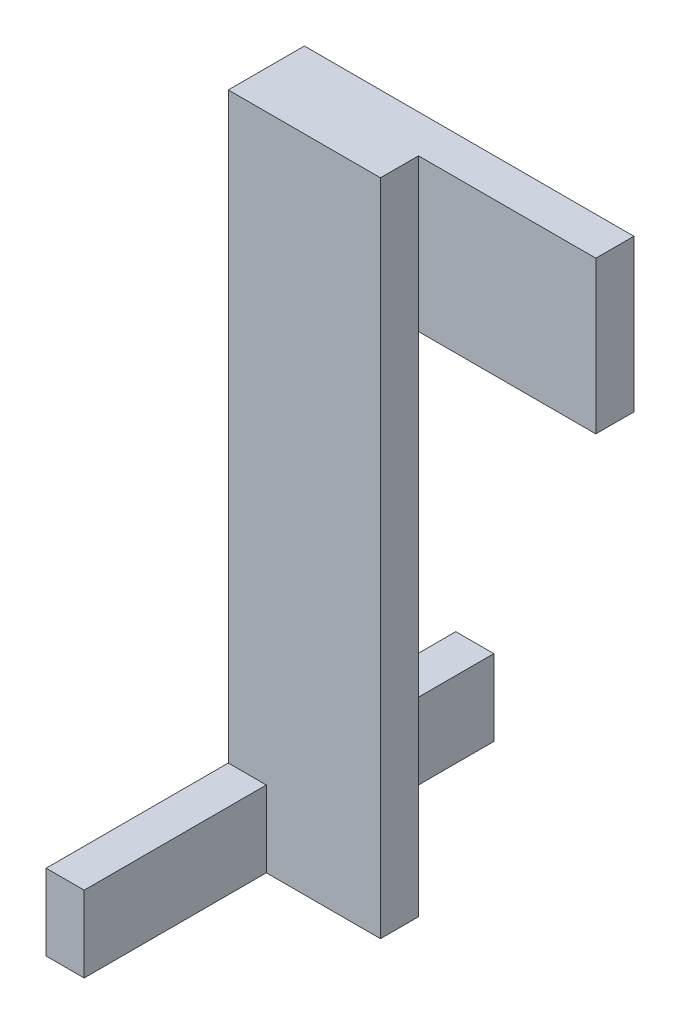
ISO-10303-21;
HEADER;
FILE_DESCRIPTION(('STEP AP214'),'2;1');
FILE_NAME('part.step','',(''),(''),'','','');
FILE_SCHEMA(('AUTOMOTIVE_DESIGN { 1 0 10303 214 1 1 1 1 }'));
ENDSEC;
DATA;
#1=APPLICATION_CONTEXT('core data for automotive mechanical design processes');
#2=APPLICATION_PROTOCOL_DEFINITION('international standard','automotive_design',2000,#1);
#3=PRODUCT_CONTEXT('',#1,'mechanical');
#4=PRODUCT('Part','Part','',(#3));
#5=PRODUCT_RELATED_PRODUCT_CATEGORY('part','',(#4));
#6=PRODUCT_DEFINITION_FORMATION('','',#4);
#7=PRODUCT_DEFINITION_CONTEXT('part definition',#1,'design');
#8=PRODUCT_DEFINITION('design','',#6,#7);
#9=PRODUCT_DEFINITION_SHAPE('','',#8);
#10=(LENGTH_UNIT() NAMED_UNIT(*) SI_UNIT(.MILLI.,.METRE.));
#11=(NAMED_UNIT(*) PLANE_ANGLE_UNIT() SI_UNIT($,.RADIAN.));
#12=(NAMED_UNIT(*) SI_UNIT($,.STERADIAN.) SOLID_ANGLE_UNIT());
#13=UNCERTAINTY_MEASURE_WITH_UNIT(LENGTH_MEASURE(1.E-05),#10,'distance_accuracy_value','');
#14=(GEOMETRIC_REPRESENTATION_CONTEXT(3) GLOBAL_UNCERTAINTY_ASSIGNED_CONTEXT((#13)) GLOBAL_UNIT_ASSIGNED_CONTEXT((#10,
#11,#12)) REPRESENTATION_CONTEXT('',''));
#15=CARTESIAN_POINT('',(0.,0.,0.));
#16=DIRECTION('',(0.,0.,1.));
#17=DIRECTION('',(1.,0.,0.));
#18=AXIS2_PLACEMENT_3D('',#15,#16,#17);
#19=CARTESIAN_POINT('',(0.,0.,0.));
#20=DIRECTION('',(0.,0.,1.));
#21=DIRECTION('',(1.,0.,0.));
#22=AXIS2_PLACEMENT_3D('',#19,#20,#21);
#23=PLANE('',#22);
#24=DIRECTION('',(0.,1.,0.));
#25=VECTOR('',#24,1.);
#26=CARTESIAN_POINT('',(-12.7,0.,0.));
#27=LINE('',#26,#25);
#28=CARTESIAN_POINT('',(-12.7,-110.,0.));
#29=VERTEX_POINT('',#28);
#30=CARTESIAN_POINT('',(-12.7,-84.6,0.));
#31=VERTEX_POINT('',#30);
#32=EDGE_CURVE('E148',#29,#31,#27,.T.);
#33=ORIENTED_EDGE('',*,*,#32,.T.);
#34=DIRECTION('',(-1.,0.,0.));
#35=VECTOR('',#34,1.);
#36=CARTESIAN_POINT('',(0.,-84.6,0.));
#37=LINE('',#36,#35);
#38=CARTESIAN_POINT('',(-25.4,-84.6,0.));
#39=VERTEX_POINT('',#38);
#40=EDGE_CURVE('E177',#31,#39,#37,.T.);
#41=ORIENTED_EDGE('',*,*,#40,.T.);
#42=DIRECTION('',(0.,-1.,0.));
#43=VECTOR('',#42,1.);
#44=CARTESIAN_POINT('',(-25.4,-110.,0.));
#45=LINE('',#44,#43);
#46=CARTESIAN_POINT('',(-25.4,59.2,0.));
#47=VERTEX_POINT('',#46);
#48=EDGE_CURVE('E206',#47,#39,#45,.T.);
#49=ORIENTED_EDGE('',*,*,#48,.F.);
#50=DIRECTION('',(-1.,0.,0.));
#51=VECTOR('',#50,1.);
#52=CARTESIAN_POINT('',(-25.4,59.2,0.));
#53=LINE('',#52,#51);
#54=CARTESIAN_POINT('',(25.4,59.2,0.));
#55=VERTEX_POINT('',#54);
#56=EDGE_CURVE('E197',#55,#47,#53,.T.);
#57=ORIENTED_EDGE('',*,*,#56,.F.);
#58=DIRECTION('',(0.,1.,0.));
#59=VECTOR('',#58,1.);
#60=CARTESIAN_POINT('',(25.4,-110.,0.));
#61=LINE('',#60,#59);
#62=CARTESIAN_POINT('',(25.4,-110.,0.));
#63=VERTEX_POINT('',#62);
#64=EDGE_CURVE('E210',#63,#55,#61,.T.);
#65=ORIENTED_EDGE('',*,*,#64,.F.);
#66=DIRECTION('',(1.,0.,0.));
#67=VECTOR('',#66,1.);
#68=CARTESIAN_POINT('',(25.4,-110.,0.));
#69=LINE('',#68,#67);
#70=EDGE_CURVE('E219',#29,#63,#69,.T.);
#71=ORIENTED_EDGE('',*,*,#70,.F.);
#72=EDGE_LOOP('',(#33,#41,#49,#57,#65,#71));
#73=FACE_BOUND('',#72,.T.);
#74=ADVANCED_FACE('F35',(#73),#23,.F.);
#75=CARTESIAN_POINT('',(-25.4,-110.,12.7));
#76=DIRECTION('',(1.,0.,0.));
#77=DIRECTION('',(0.,0.,-1.));
#78=AXIS2_PLACEMENT_3D('',#75,#76,#77);
#79=PLANE('',#78);
#80=ORIENTED_EDGE('',*,*,#48,.T.);
#81=DIRECTION('',(0.,0.,-1.));
#82=VECTOR('',#81,1.);
#83=CARTESIAN_POINT('',(-25.4,-84.6,-63.2444511424242));
#84=LINE('',#83,#82);
#85=CARTESIAN_POINT('',(-25.4,-84.6,-63.2444511424242));
#86=VERTEX_POINT('',#85);
#87=EDGE_CURVE('E159',#39,#86,#84,.T.);
#88=ORIENTED_EDGE('',*,*,#87,.T.);
#89=DIRECTION('',(0.,-1.,0.));
#90=VECTOR('',#89,1.);
#91=CARTESIAN_POINT('',(-25.4,-110.,-63.2444511424242));
#92=LINE('',#91,#90);
#93=CARTESIAN_POINT('',(-25.4,-110.,-63.2444511424242));
#94=VERTEX_POINT('',#93);
#95=EDGE_CURVE('E167',#86,#94,#92,.T.);
#96=ORIENTED_EDGE('',*,*,#95,.T.);
#97=DIRECTION('',(0.,0.,-1.));
#98=VECTOR('',#97,1.);
#99=CARTESIAN_POINT('',(-25.4,-110.,12.7));
#100=LINE('',#99,#98);
#101=CARTESIAN_POINT('',(-25.4,-110.,73.5129229146259));
#102=VERTEX_POINT('',#101);
#103=EDGE_CURVE('E134',#102,#94,#100,.T.);
#104=ORIENTED_EDGE('',*,*,#103,.F.);
#105=DIRECTION('',(0.,1.,0.));
#106=VECTOR('',#105,1.);
#107=CARTESIAN_POINT('',(-25.4,-110.,73.5129229146259));
#108=LINE('',#107,#106);
#109=CARTESIAN_POINT('',(-25.4,-84.6,73.5129229146259));
#110=VERTEX_POINT('',#109);
#111=EDGE_CURVE('E169',#102,#110,#108,.T.);
#112=ORIENTED_EDGE('',*,*,#111,.T.);
#113=CARTESIAN_POINT('',(-25.4,-84.6,12.7));
#114=VERTEX_POINT('',#113);
#115=EDGE_CURVE('E156',#110,#114,#84,.T.);
#116=ORIENTED_EDGE('',*,*,#115,.T.);
#117=DIRECTION('',(0.,-1.,0.));
#118=VECTOR('',#117,1.);
#119=CARTESIAN_POINT('',(-25.4,-110.,12.7));
#120=LINE('',#119,#118);
#121=CARTESIAN_POINT('',(-25.4,110.,12.7));
#122=VERTEX_POINT('',#121);
#123=EDGE_CURVE('E207',#122,#114,#120,.T.);
#124=ORIENTED_EDGE('',*,*,#123,.F.);
#125=DIRECTION('',(0.,0.,-1.));
#126=VECTOR('',#125,1.);
#127=CARTESIAN_POINT('',(-25.4,110.,12.7));
#128=LINE('',#127,#126);
#129=CARTESIAN_POINT('',(-25.4,110.,-12.7));
#130=VERTEX_POINT('',#129);
#131=EDGE_CURVE('E216',#122,#130,#128,.T.);
#132=ORIENTED_EDGE('',*,*,#131,.T.);
#133=DIRECTION('',(0.,1.,0.));
#134=VECTOR('',#133,1.);
#135=CARTESIAN_POINT('',(-25.4,110.,-12.7));
#136=LINE('',#135,#134);
#137=CARTESIAN_POINT('',(-25.4,59.2,-12.7));
#138=VERTEX_POINT('',#137);
#139=EDGE_CURVE('E181',#138,#130,#136,.T.);
#140=ORIENTED_EDGE('',*,*,#139,.F.);
#141=DIRECTION('',(0.,0.,1.));
#142=VECTOR('',#141,1.);
#143=CARTESIAN_POINT('',(-25.4,59.2,-12.7));
#144=LINE('',#143,#142);
#145=EDGE_CURVE('E191',#138,#47,#144,.T.);
#146=ORIENTED_EDGE('',*,*,#145,.T.);
#147=EDGE_LOOP('',(#80,#88,#96,#104,#112,#116,#124,#132,#140,#146));
#148=FACE_BOUND('',#147,.T.);
#149=ADVANCED_FACE('F37',(#148),#79,.F.);
#150=CARTESIAN_POINT('',(25.4,-110.,12.7));
#151=DIRECTION('',(0.,1.,0.));
#152=DIRECTION('',(0.,0.,1.));
#153=AXIS2_PLACEMENT_3D('',#150,#151,#152);
#154=PLANE('',#153);
#155=DIRECTION('',(1.,0.,0.));
#156=VECTOR('',#155,1.);
#157=CARTESIAN_POINT('',(25.4,-110.,12.7));
#158=LINE('',#157,#156);
#159=CARTESIAN_POINT('',(-12.7,-110.,12.7));
#160=VERTEX_POINT('',#159);
#161=CARTESIAN_POINT('',(25.4,-110.,12.7));
#162=VERTEX_POINT('',#161);
#163=EDGE_CURVE('E209',#160,#162,#158,.T.);
#164=ORIENTED_EDGE('',*,*,#163,.F.);
#165=DIRECTION('',(0.,0.,1.));
#166=VECTOR('',#165,1.);
#167=CARTESIAN_POINT('',(-12.7,-110.,-63.2444511424242));
#168=LINE('',#167,#166);
#169=CARTESIAN_POINT('',(-12.7,-110.,73.5129229146259));
#170=VERTEX_POINT('',#169);
#171=EDGE_CURVE('E150',#160,#170,#168,.T.);
#172=ORIENTED_EDGE('',*,*,#171,.T.);
#173=DIRECTION('',(-1.,0.,0.));
#174=VECTOR('',#173,1.);
#175=CARTESIAN_POINT('',(-12.7,-110.,73.5129229146259));
#176=LINE('',#175,#174);
#177=EDGE_CURVE('E139',#170,#102,#176,.T.);
#178=ORIENTED_EDGE('',*,*,#177,.T.);
#179=ORIENTED_EDGE('',*,*,#103,.T.);
#180=DIRECTION('',(-1.,0.,0.));
#181=VECTOR('',#180,1.);
#182=CARTESIAN_POINT('',(-12.7,-110.,-63.2444511424242));
#183=LINE('',#182,#181);
#184=CARTESIAN_POINT('',(-12.7,-110.,-63.2444511424242));
#185=VERTEX_POINT('',#184);
#186=EDGE_CURVE('E128',#185,#94,#183,.T.);
#187=ORIENTED_EDGE('',*,*,#186,.F.);
#188=EDGE_CURVE('E131',#185,#29,#168,.T.);
#189=ORIENTED_EDGE('',*,*,#188,.T.);
#190=ORIENTED_EDGE('',*,*,#70,.T.);
#191=DIRECTION('',(0.,0.,-1.));
#192=VECTOR('',#191,1.);
#193=CARTESIAN_POINT('',(25.4,-110.,12.7));
#194=LINE('',#193,#192);
#195=EDGE_CURVE('E228',#162,#63,#194,.T.);
#196=ORIENTED_EDGE('',*,*,#195,.F.);
#197=EDGE_LOOP('',(#164,#172,#178,#179,#187,#189,#190,#196));
#198=FACE_BOUND('',#197,.T.);
#199=ADVANCED_FACE('F130',(#198),#154,.F.);
#200=CARTESIAN_POINT('',(25.4,-110.,12.7));
#201=DIRECTION('',(-1.,0.,0.));
#202=DIRECTION('',(0.,0.,1.));
#203=AXIS2_PLACEMENT_3D('',#200,#201,#202);
#204=PLANE('',#203);
#205=ORIENTED_EDGE('',*,*,#64,.T.);
#206=CARTESIAN_POINT('',(25.4,110.,0.));
#207=VERTEX_POINT('',#206);
#208=EDGE_CURVE('E221',#55,#207,#61,.T.);
#209=ORIENTED_EDGE('',*,*,#208,.T.);
#210=DIRECTION('',(0.,0.,-1.));
#211=VECTOR('',#210,1.);
#212=CARTESIAN_POINT('',(25.4,110.,12.7));
#213=LINE('',#212,#211);
#214=CARTESIAN_POINT('',(25.4,110.,12.7));
#215=VERTEX_POINT('',#214);
#216=EDGE_CURVE('E225',#215,#207,#213,.T.);
#217=ORIENTED_EDGE('',*,*,#216,.F.);
#218=DIRECTION('',(0.,1.,0.));
#219=VECTOR('',#218,1.);
#220=CARTESIAN_POINT('',(25.4,-110.,12.7));
#221=LINE('',#220,#219);
#222=EDGE_CURVE('E212',#162,#215,#221,.T.);
#223=ORIENTED_EDGE('',*,*,#222,.F.);
#224=ORIENTED_EDGE('',*,*,#195,.T.);
#225=EDGE_LOOP('',(#205,#209,#217,#223,#224));
#226=FACE_BOUND('',#225,.T.);
#227=ADVANCED_FACE('F260',(#226),#204,.F.);
#228=CARTESIAN_POINT('',(25.4,110.,12.7));
#229=DIRECTION('',(0.,-1.,0.));
#230=DIRECTION('',(0.,0.,-1.));
#231=AXIS2_PLACEMENT_3D('',#228,#229,#230);
#232=PLANE('',#231);
#233=ORIENTED_EDGE('',*,*,#216,.T.);
#234=DIRECTION('',(1.,0.,0.));
#235=VECTOR('',#234,1.);
#236=CARTESIAN_POINT('',(-25.4,110.,0.));
#237=LINE('',#236,#235);
#238=CARTESIAN_POINT('',(84.6,110.,0.));
#239=VERTEX_POINT('',#238);
#240=EDGE_CURVE('E180',#207,#239,#237,.T.);
#241=ORIENTED_EDGE('',*,*,#240,.T.);
#242=DIRECTION('',(0.,0.,1.));
#243=VECTOR('',#242,1.);
#244=CARTESIAN_POINT('',(84.6,110.,-12.7));
#245=LINE('',#244,#243);
#246=CARTESIAN_POINT('',(84.6,110.,-12.7));
#247=VERTEX_POINT('',#246);
#248=EDGE_CURVE('E203',#247,#239,#245,.T.);
#249=ORIENTED_EDGE('',*,*,#248,.F.);
#250=DIRECTION('',(1.,0.,0.));
#251=VECTOR('',#250,1.);
#252=CARTESIAN_POINT('',(-25.4,110.,-12.7));
#253=LINE('',#252,#251);
#254=EDGE_CURVE('E184',#130,#247,#253,.T.);
#255=ORIENTED_EDGE('',*,*,#254,.F.);
#256=ORIENTED_EDGE('',*,*,#131,.F.);
#257=DIRECTION('',(-1.,0.,0.));
#258=VECTOR('',#257,1.);
#259=CARTESIAN_POINT('',(25.4,110.,12.7));
#260=LINE('',#259,#258);
#261=EDGE_CURVE('E214',#215,#122,#260,.T.);
#262=ORIENTED_EDGE('',*,*,#261,.F.);
#263=EDGE_LOOP('',(#233,#241,#249,#255,#256,#262));
#264=FACE_BOUND('',#263,.T.);
#265=ADVANCED_FACE('F264',(#264),#232,.F.);
#266=CARTESIAN_POINT('',(0.,0.,12.7));
#267=DIRECTION('',(0.,0.,1.));
#268=DIRECTION('',(1.,0.,0.));
#269=AXIS2_PLACEMENT_3D('',#266,#267,#268);
#270=PLANE('',#269);
#271=DIRECTION('',(-1.,0.,0.));
#272=VECTOR('',#271,1.);
#273=CARTESIAN_POINT('',(0.,-84.6,12.7));
#274=LINE('',#273,#272);
#275=CARTESIAN_POINT('',(-12.7,-84.6,12.7));
#276=VERTEX_POINT('',#275);
#277=EDGE_CURVE('E11',#276,#114,#274,.T.);
#278=ORIENTED_EDGE('',*,*,#277,.F.);
#279=DIRECTION('',(0.,1.,0.));
#280=VECTOR('',#279,1.);
#281=CARTESIAN_POINT('',(-12.7,0.,12.7));
#282=LINE('',#281,#280);
#283=EDGE_CURVE('E43',#160,#276,#282,.T.);
#284=ORIENTED_EDGE('',*,*,#283,.F.);
#285=ORIENTED_EDGE('',*,*,#163,.T.);
#286=ORIENTED_EDGE('',*,*,#222,.T.);
#287=ORIENTED_EDGE('',*,*,#261,.T.);
#288=ORIENTED_EDGE('',*,*,#123,.T.);
#289=EDGE_LOOP('',(#278,#284,#285,#286,#287,#288));
#290=FACE_BOUND('',#289,.T.);
#291=ADVANCED_FACE('F265',(#290),#270,.T.);
#292=CARTESIAN_POINT('',(0.,0.,0.));
#293=DIRECTION('',(0.,0.,1.));
#294=DIRECTION('',(1.,0.,0.));
#295=AXIS2_PLACEMENT_3D('',#292,#293,#294);
#296=PLANE('',#295);
#297=ORIENTED_EDGE('',*,*,#208,.F.);
#298=CARTESIAN_POINT('',(84.6,59.2,0.));
#299=VERTEX_POINT('',#298);
#300=EDGE_CURVE('E185',#299,#55,#53,.T.);
#301=ORIENTED_EDGE('',*,*,#300,.F.);
#302=DIRECTION('',(0.,-1.,0.));
#303=VECTOR('',#302,1.);
#304=CARTESIAN_POINT('',(84.6,110.,0.));
#305=LINE('',#304,#303);
#306=EDGE_CURVE('E193',#239,#299,#305,.T.);
#307=ORIENTED_EDGE('',*,*,#306,.F.);
#308=ORIENTED_EDGE('',*,*,#240,.F.);
#309=EDGE_LOOP('',(#297,#301,#307,#308));
#310=FACE_BOUND('',#309,.T.);
#311=ADVANCED_FACE('F256',(#310),#296,.T.);
#312=CARTESIAN_POINT('',(84.6,110.,-12.7));
#313=DIRECTION('',(-1.,0.,0.));
#314=DIRECTION('',(0.,-1.,0.));
#315=AXIS2_PLACEMENT_3D('',#312,#313,#314);
#316=PLANE('',#315);
#317=ORIENTED_EDGE('',*,*,#306,.T.);
#318=DIRECTION('',(0.,0.,1.));
#319=VECTOR('',#318,1.);
#320=CARTESIAN_POINT('',(84.6,59.2,-12.7));
#321=LINE('',#320,#319);
#322=CARTESIAN_POINT('',(84.6,59.2,-12.7));
#323=VERTEX_POINT('',#322);
#324=EDGE_CURVE('E200',#323,#299,#321,.T.);
#325=ORIENTED_EDGE('',*,*,#324,.F.);
#326=DIRECTION('',(0.,-1.,0.));
#327=VECTOR('',#326,1.);
#328=CARTESIAN_POINT('',(84.6,110.,-12.7));
#329=LINE('',#328,#327);
#330=EDGE_CURVE('E187',#247,#323,#329,.T.);
#331=ORIENTED_EDGE('',*,*,#330,.F.);
#332=ORIENTED_EDGE('',*,*,#248,.T.);
#333=EDGE_LOOP('',(#317,#325,#331,#332));
#334=FACE_BOUND('',#333,.T.);
#335=ADVANCED_FACE('F351',(#334),#316,.F.);
#336=CARTESIAN_POINT('',(-25.4,59.2,-12.7));
#337=DIRECTION('',(0.,1.,0.));
#338=DIRECTION('',(-1.,0.,0.));
#339=AXIS2_PLACEMENT_3D('',#336,#337,#338);
#340=PLANE('',#339);
#341=ORIENTED_EDGE('',*,*,#300,.T.);
#342=ORIENTED_EDGE('',*,*,#56,.T.);
#343=ORIENTED_EDGE('',*,*,#145,.F.);
#344=DIRECTION('',(-1.,0.,0.));
#345=VECTOR('',#344,1.);
#346=CARTESIAN_POINT('',(-25.4,59.2,-12.7));
#347=LINE('',#346,#345);
#348=EDGE_CURVE('E189',#323,#138,#347,.T.);
#349=ORIENTED_EDGE('',*,*,#348,.F.);
#350=ORIENTED_EDGE('',*,*,#324,.T.);
#351=EDGE_LOOP('',(#341,#342,#343,#349,#350));
#352=FACE_BOUND('',#351,.T.);
#353=ADVANCED_FACE('F237',(#352),#340,.F.);
#354=CARTESIAN_POINT('',(0.,0.,-12.7));
#355=DIRECTION('',(0.,0.,1.));
#356=DIRECTION('',(1.,0.,0.));
#357=AXIS2_PLACEMENT_3D('',#354,#355,#356);
#358=PLANE('',#357);
#359=ORIENTED_EDGE('',*,*,#139,.T.);
#360=ORIENTED_EDGE('',*,*,#254,.T.);
#361=ORIENTED_EDGE('',*,*,#330,.T.);
#362=ORIENTED_EDGE('',*,*,#348,.T.);
#363=EDGE_LOOP('',(#359,#360,#361,#362));
#364=FACE_BOUND('',#363,.T.);
#365=ADVANCED_FACE('F248',(#364),#358,.F.);
#366=CARTESIAN_POINT('',(-12.7,-110.,73.5129229146259));
#367=DIRECTION('',(0.,0.,1.));
#368=DIRECTION('',(1.,0.,0.));
#369=AXIS2_PLACEMENT_3D('',#366,#367,#368);
#370=PLANE('',#369);
#371=ORIENTED_EDGE('',*,*,#111,.F.);
#372=ORIENTED_EDGE('',*,*,#177,.F.);
#373=DIRECTION('',(0.,1.,0.));
#374=VECTOR('',#373,1.);
#375=CARTESIAN_POINT('',(-12.7,-110.,73.5129229146259));
#376=LINE('',#375,#374);
#377=CARTESIAN_POINT('',(-12.7,-84.6,73.5129229146259));
#378=VERTEX_POINT('',#377);
#379=EDGE_CURVE('E149',#170,#378,#376,.T.);
#380=ORIENTED_EDGE('',*,*,#379,.T.);
#381=DIRECTION('',(-1.,0.,0.));
#382=VECTOR('',#381,1.);
#383=CARTESIAN_POINT('',(-12.7,-84.6,73.5129229146259));
#384=LINE('',#383,#382);
#385=EDGE_CURVE('E173',#378,#110,#384,.T.);
#386=ORIENTED_EDGE('',*,*,#385,.T.);
#387=EDGE_LOOP('',(#371,#372,#380,#386));
#388=FACE_BOUND('',#387,.T.);
#389=ADVANCED_FACE('F274',(#388),#370,.T.);
#390=CARTESIAN_POINT('',(-12.7,0.,0.));
#391=DIRECTION('',(1.,0.,0.));
#392=DIRECTION('',(0.,0.,-1.));
#393=AXIS2_PLACEMENT_3D('',#390,#391,#392);
#394=PLANE('',#393);
#395=ORIENTED_EDGE('',*,*,#171,.F.);
#396=ORIENTED_EDGE('',*,*,#283,.T.);
#397=DIRECTION('',(0.,0.,-1.));
#398=VECTOR('',#397,1.);
#399=CARTESIAN_POINT('',(-12.7,-84.6,-63.2444511424242));
#400=LINE('',#399,#398);
#401=EDGE_CURVE('E140',#378,#276,#400,.T.);
#402=ORIENTED_EDGE('',*,*,#401,.F.);
#403=ORIENTED_EDGE('',*,*,#379,.F.);
#404=EDGE_LOOP('',(#395,#396,#402,#403));
#405=FACE_BOUND('',#404,.T.);
#406=ADVANCED_FACE('F277',(#405),#394,.T.);
#407=CARTESIAN_POINT('',(-12.7,-84.6,-63.2444511424242));
#408=DIRECTION('',(0.,1.,0.));
#409=DIRECTION('',(0.,0.,1.));
#410=AXIS2_PLACEMENT_3D('',#407,#408,#409);
#411=PLANE('',#410);
#412=ORIENTED_EDGE('',*,*,#401,.T.);
#413=ORIENTED_EDGE('',*,*,#277,.T.);
#414=ORIENTED_EDGE('',*,*,#115,.F.);
#415=ORIENTED_EDGE('',*,*,#385,.F.);
#416=EDGE_LOOP('',(#412,#413,#414,#415));
#417=FACE_BOUND('',#416,.T.);
#418=ADVANCED_FACE('F276',(#417),#411,.T.);
#419=ORIENTED_EDGE('',*,*,#40,.F.);
#420=CARTESIAN_POINT('',(-12.7,-84.6,-63.2444511424242));
#421=VERTEX_POINT('',#420);
#422=EDGE_CURVE('E164',#31,#421,#400,.T.);
#423=ORIENTED_EDGE('',*,*,#422,.T.);
#424=DIRECTION('',(-1.,0.,0.));
#425=VECTOR('',#424,1.);
#426=CARTESIAN_POINT('',(-12.7,-84.6,-63.2444511424242));
#427=LINE('',#426,#425);
#428=EDGE_CURVE('E155',#421,#86,#427,.T.);
#429=ORIENTED_EDGE('',*,*,#428,.T.);
#430=ORIENTED_EDGE('',*,*,#87,.F.);
#431=EDGE_LOOP('',(#419,#423,#429,#430));
#432=FACE_BOUND('',#431,.T.);
#433=ADVANCED_FACE('F268',(#432),#411,.T.);
#434=ORIENTED_EDGE('',*,*,#32,.F.);
#435=ORIENTED_EDGE('',*,*,#188,.F.);
#436=DIRECTION('',(0.,-1.,0.));
#437=VECTOR('',#436,1.);
#438=CARTESIAN_POINT('',(-12.7,-110.,-63.2444511424242));
#439=LINE('',#438,#437);
#440=EDGE_CURVE('E146',#421,#185,#439,.T.);
#441=ORIENTED_EDGE('',*,*,#440,.F.);
#442=ORIENTED_EDGE('',*,*,#422,.F.);
#443=EDGE_LOOP('',(#434,#435,#441,#442));
#444=FACE_BOUND('',#443,.T.);
#445=ADVANCED_FACE('F144',(#444),#394,.T.);
#446=CARTESIAN_POINT('',(-12.7,-110.,-63.2444511424242));
#447=DIRECTION('',(0.,0.,-1.));
#448=DIRECTION('',(-1.,0.,0.));
#449=AXIS2_PLACEMENT_3D('',#446,#447,#448);
#450=PLANE('',#449);
#451=ORIENTED_EDGE('',*,*,#95,.F.);
#452=ORIENTED_EDGE('',*,*,#428,.F.);
#453=ORIENTED_EDGE('',*,*,#440,.T.);
#454=ORIENTED_EDGE('',*,*,#186,.T.);
#455=EDGE_LOOP('',(#451,#452,#453,#454));
#456=FACE_BOUND('',#455,.T.);
#457=ADVANCED_FACE('F153',(#456),#450,.T.);
#458=CLOSED_SHELL('',(#74,#149,#199,#227,#265,#291,#311,#335,#353,#365,#389,#406,#418,#433,#445,#457));
#459=MANIFOLD_SOLID_BREP('B2',#458);
#460=ADVANCED_BREP_SHAPE_REPRESENTATION('',(#18,#459),#14);
#461=SHAPE_DEFINITION_REPRESENTATION(#9,#460);
ENDSEC;
END-ISO-10303-21;
